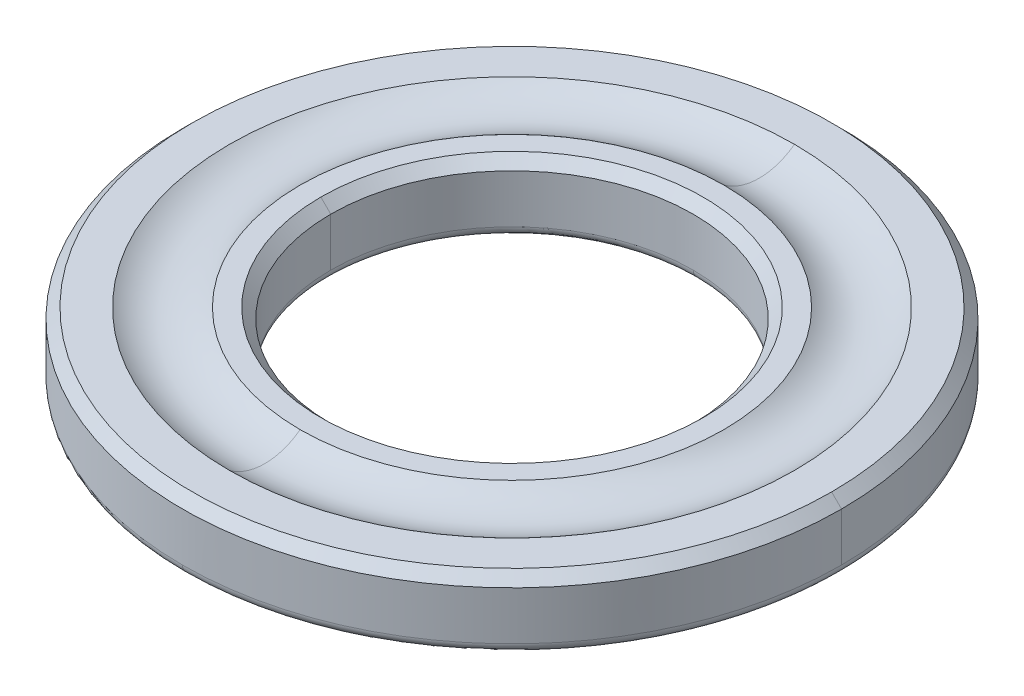
ISO-10303-21;
HEADER;
FILE_DESCRIPTION(('STEP AP214'),'2;1');
FILE_NAME('part.step','',(''),(''),'','','');
FILE_SCHEMA(('AUTOMOTIVE_DESIGN { 1 0 10303 214 1 1 1 1 }'));
ENDSEC;
DATA;
#1=APPLICATION_CONTEXT('core data for automotive mechanical design processes');
#2=APPLICATION_PROTOCOL_DEFINITION('international standard','automotive_design',2000,#1);
#3=PRODUCT_CONTEXT('',#1,'mechanical');
#4=PRODUCT('Part','Part','',(#3));
#5=PRODUCT_RELATED_PRODUCT_CATEGORY('part','',(#4));
#6=PRODUCT_DEFINITION_FORMATION('','',#4);
#7=PRODUCT_DEFINITION_CONTEXT('part definition',#1,'design');
#8=PRODUCT_DEFINITION('design','',#6,#7);
#9=PRODUCT_DEFINITION_SHAPE('','',#8);
#10=(LENGTH_UNIT() NAMED_UNIT(*) SI_UNIT(.MILLI.,.METRE.));
#11=(NAMED_UNIT(*) PLANE_ANGLE_UNIT() SI_UNIT($,.RADIAN.));
#12=(NAMED_UNIT(*) SI_UNIT($,.STERADIAN.) SOLID_ANGLE_UNIT());
#13=UNCERTAINTY_MEASURE_WITH_UNIT(LENGTH_MEASURE(1.E-05),#10,'distance_accuracy_value','');
#14=(GEOMETRIC_REPRESENTATION_CONTEXT(3) GLOBAL_UNCERTAINTY_ASSIGNED_CONTEXT((#13)) GLOBAL_UNIT_ASSIGNED_CONTEXT((#10,
#11,#12)) REPRESENTATION_CONTEXT('',''));
#15=CARTESIAN_POINT('',(0.,0.,0.));
#16=DIRECTION('',(0.,0.,1.));
#17=DIRECTION('',(1.,0.,0.));
#18=AXIS2_PLACEMENT_3D('',#15,#16,#17);
#19=CARTESIAN_POINT('',(0.,0.6,0.));
#20=DIRECTION('',(0.,1.,0.));
#21=DIRECTION('',(0.,0.,1.));
#22=AXIS2_PLACEMENT_3D('',#19,#20,#21);
#23=TOROIDAL_SURFACE('',#22,19.4,0.6);
#24=CARTESIAN_POINT('',(0.,0.6,-19.4));
#25=DIRECTION('',(1.,0.,0.));
#26=DIRECTION('',(0.,0.,-1.));
#27=AXIS2_PLACEMENT_3D('',#24,#25,#26);
#28=CIRCLE('',#27,0.6);
#29=CARTESIAN_POINT('',(0.,0.,-19.4));
#30=VERTEX_POINT('',#29);
#31=CARTESIAN_POINT('',(0.,0.6,-20.));
#32=VERTEX_POINT('',#31);
#33=EDGE_CURVE('E181',#30,#32,#28,.T.);
#34=ORIENTED_EDGE('',*,*,#33,.F.);
#35=CARTESIAN_POINT('',(0.,0.,0.));
#36=DIRECTION('',(0.,1.,0.));
#37=DIRECTION('',(1.,0.,0.));
#38=AXIS2_PLACEMENT_3D('',#35,#36,#37);
#39=CIRCLE('',#38,19.4);
#40=CARTESIAN_POINT('',(0.,0.,19.4));
#41=VERTEX_POINT('',#40);
#42=EDGE_CURVE('E147',#30,#41,#39,.T.);
#43=ORIENTED_EDGE('',*,*,#42,.T.);
#44=CARTESIAN_POINT('',(0.,0.6,19.4));
#45=DIRECTION('',(-1.,0.,0.));
#46=DIRECTION('',(0.,0.,1.));
#47=AXIS2_PLACEMENT_3D('',#44,#45,#46);
#48=CIRCLE('',#47,0.6);
#49=CARTESIAN_POINT('',(0.,0.6,20.));
#50=VERTEX_POINT('',#49);
#51=EDGE_CURVE('E202',#41,#50,#48,.T.);
#52=ORIENTED_EDGE('',*,*,#51,.T.);
#53=CARTESIAN_POINT('',(0.,0.6,0.));
#54=DIRECTION('',(0.,1.,0.));
#55=DIRECTION('',(1.,0.,0.));
#56=AXIS2_PLACEMENT_3D('',#53,#54,#55);
#57=CIRCLE('',#56,20.);
#58=CARTESIAN_POINT('',(-20.,0.6,0.));
#59=VERTEX_POINT('',#58);
#60=EDGE_CURVE('E158',#59,#50,#57,.T.);
#61=ORIENTED_EDGE('',*,*,#60,.F.);
#62=CARTESIAN_POINT('',(0.,0.6,0.));
#63=DIRECTION('',(0.,1.,0.));
#64=DIRECTION('',(1.,0.,0.));
#65=AXIS2_PLACEMENT_3D('',#62,#63,#64);
#66=CIRCLE('',#65,20.);
#67=EDGE_CURVE('E11',#32,#59,#66,.T.);
#68=ORIENTED_EDGE('',*,*,#67,.F.);
#69=EDGE_LOOP('',(#34,#43,#52,#61,#68));
#70=FACE_BOUND('',#69,.T.);
#71=ADVANCED_FACE('F17',(#70),#23,.T.);
#72=CARTESIAN_POINT('',(0.,2.0712,0.));
#73=DIRECTION('',(0.,-1.,0.));
#74=DIRECTION('',(1.,0.,0.));
#75=AXIS2_PLACEMENT_3D('',#72,#73,#74);
#76=CYLINDRICAL_SURFACE('',#75,20.);
#77=DIRECTION('',(0.,-1.,0.));
#78=VECTOR('',#77,1.);
#79=CARTESIAN_POINT('',(-20.,2.0712,0.));
#80=LINE('',#79,#78);
#81=CARTESIAN_POINT('',(-20.,3.5424,0.));
#82=VERTEX_POINT('',#81);
#83=EDGE_CURVE('E162',#82,#59,#80,.T.);
#84=ORIENTED_EDGE('',*,*,#83,.F.);
#85=CARTESIAN_POINT('',(0.,3.5424,0.));
#86=DIRECTION('',(0.,1.,0.));
#87=DIRECTION('',(1.,0.,0.));
#88=AXIS2_PLACEMENT_3D('',#85,#86,#87);
#89=CIRCLE('',#88,20.);
#90=CARTESIAN_POINT('',(20.,3.5424,0.));
#91=VERTEX_POINT('',#90);
#92=EDGE_CURVE('E28',#91,#82,#89,.T.);
#93=ORIENTED_EDGE('',*,*,#92,.F.);
#94=DIRECTION('',(0.,-1.,0.));
#95=VECTOR('',#94,1.);
#96=CARTESIAN_POINT('',(20.,2.0712,0.));
#97=LINE('',#96,#95);
#98=CARTESIAN_POINT('',(20.,0.6,0.));
#99=VERTEX_POINT('',#98);
#100=EDGE_CURVE('E161',#91,#99,#97,.T.);
#101=ORIENTED_EDGE('',*,*,#100,.T.);
#102=CARTESIAN_POINT('',(0.,0.6,0.));
#103=DIRECTION('',(0.,1.,0.));
#104=DIRECTION('',(1.,0.,0.));
#105=AXIS2_PLACEMENT_3D('',#102,#103,#104);
#106=CIRCLE('',#105,20.);
#107=EDGE_CURVE('E184',#99,#32,#106,.T.);
#108=ORIENTED_EDGE('',*,*,#107,.T.);
#109=ORIENTED_EDGE('',*,*,#67,.T.);
#110=EDGE_LOOP('',(#84,#93,#101,#108,#109));
#111=FACE_BOUND('',#110,.T.);
#112=ADVANCED_FACE('F212',(#111),#76,.T.);
#113=CARTESIAN_POINT('',(0.,3.8424,0.));
#114=DIRECTION('',(0.,-1.,0.));
#115=DIRECTION('',(1.,0.,0.));
#116=AXIS2_PLACEMENT_3D('',#113,#114,#115);
#117=CONICAL_SURFACE('',#116,19.7,0.785398163397452);
#118=DIRECTION('',(-0.70710678118655,-0.707106781186545,0.));
#119=VECTOR('',#118,1.);
#120=CARTESIAN_POINT('',(-19.7,3.8424,0.));
#121=LINE('',#120,#119);
#122=CARTESIAN_POINT('',(-19.4,4.1424,0.));
#123=VERTEX_POINT('',#122);
#124=EDGE_CURVE('E163',#123,#82,#121,.T.);
#125=ORIENTED_EDGE('',*,*,#124,.F.);
#126=CARTESIAN_POINT('',(0.,4.1424,0.));
#127=DIRECTION('',(0.,1.,0.));
#128=DIRECTION('',(1.,0.,0.));
#129=AXIS2_PLACEMENT_3D('',#126,#127,#128);
#130=CIRCLE('',#129,19.4);
#131=CARTESIAN_POINT('',(19.4,4.1424,0.));
#132=VERTEX_POINT('',#131);
#133=EDGE_CURVE('E121',#132,#123,#130,.T.);
#134=ORIENTED_EDGE('',*,*,#133,.F.);
#135=DIRECTION('',(0.70710678118655,-0.707106781186545,0.));
#136=VECTOR('',#135,1.);
#137=CARTESIAN_POINT('',(19.7,3.8424,0.));
#138=LINE('',#137,#136);
#139=EDGE_CURVE('E167',#132,#91,#138,.T.);
#140=ORIENTED_EDGE('',*,*,#139,.T.);
#141=ORIENTED_EDGE('',*,*,#92,.T.);
#142=EDGE_LOOP('',(#125,#134,#140,#141));
#143=FACE_BOUND('',#142,.T.);
#144=ADVANCED_FACE('F323',(#143),#117,.T.);
#145=CARTESIAN_POINT('',(18.2716,4.1424,0.));
#146=DIRECTION('',(0.,1.,0.));
#147=DIRECTION('',(1.,0.,0.));
#148=AXIS2_PLACEMENT_3D('',#145,#146,#147);
#149=PLANE('',#148);
#150=CARTESIAN_POINT('',(0.,4.1424,0.));
#151=DIRECTION('',(0.,1.,0.));
#152=DIRECTION('',(1.,0.,0.));
#153=AXIS2_PLACEMENT_3D('',#150,#151,#152);
#154=CIRCLE('',#153,17.1432);
#155=CARTESIAN_POINT('',(0.,4.1424,17.1432));
#156=VERTEX_POINT('',#155);
#157=CARTESIAN_POINT('',(0.,4.1424,-17.1432));
#158=VERTEX_POINT('',#157);
#159=EDGE_CURVE('E111',#156,#158,#154,.T.);
#160=ORIENTED_EDGE('',*,*,#159,.F.);
#161=CARTESIAN_POINT('',(0.,4.1424,0.));
#162=DIRECTION('',(0.,1.,0.));
#163=DIRECTION('',(1.,0.,0.));
#164=AXIS2_PLACEMENT_3D('',#161,#162,#163);
#165=CIRCLE('',#164,17.1432);
#166=EDGE_CURVE('E116',#158,#156,#165,.T.);
#167=ORIENTED_EDGE('',*,*,#166,.F.);
#168=EDGE_LOOP('',(#160,#167));
#169=FACE_BOUND('',#168,.T.);
#170=ORIENTED_EDGE('',*,*,#133,.T.);
#171=CARTESIAN_POINT('',(0.,4.1424,0.));
#172=DIRECTION('',(0.,1.,0.));
#173=DIRECTION('',(1.,0.,0.));
#174=AXIS2_PLACEMENT_3D('',#171,#172,#173);
#175=CIRCLE('',#174,19.4);
#176=EDGE_CURVE('E168',#123,#132,#175,.T.);
#177=ORIENTED_EDGE('',*,*,#176,.T.);
#178=EDGE_LOOP('',(#170,#177));
#179=FACE_BOUND('',#178,.T.);
#180=ADVANCED_FACE('F113',(#169,#179),#149,.T.);
#181=CARTESIAN_POINT('',(0.,7.,0.));
#182=DIRECTION('',(0.,1.,0.));
#183=DIRECTION('',(0.,0.,1.));
#184=AXIS2_PLACEMENT_3D('',#181,#182,#183);
#185=TOROIDAL_SURFACE('',#184,15.,3.572);
#186=CARTESIAN_POINT('',(0.,7.,-15.));
#187=DIRECTION('',(1.,0.,0.));
#188=DIRECTION('',(0.,0.,-1.));
#189=AXIS2_PLACEMENT_3D('',#186,#187,#188);
#190=CIRCLE('',#189,3.572);
#191=CARTESIAN_POINT('',(0.,4.1424,-12.8568));
#192=VERTEX_POINT('',#191);
#193=EDGE_CURVE('E134',#192,#158,#190,.T.);
#194=ORIENTED_EDGE('',*,*,#193,.F.);
#195=CARTESIAN_POINT('',(0.,4.1424,0.));
#196=DIRECTION('',(0.,1.,0.));
#197=DIRECTION('',(1.,0.,0.));
#198=AXIS2_PLACEMENT_3D('',#195,#196,#197);
#199=CIRCLE('',#198,12.8568);
#200=CARTESIAN_POINT('',(0.,4.1424,12.8568));
#201=VERTEX_POINT('',#200);
#202=EDGE_CURVE('E122',#201,#192,#199,.T.);
#203=ORIENTED_EDGE('',*,*,#202,.F.);
#204=CARTESIAN_POINT('',(0.,7.,15.));
#205=DIRECTION('',(-1.,0.,0.));
#206=DIRECTION('',(0.,0.,1.));
#207=AXIS2_PLACEMENT_3D('',#204,#205,#206);
#208=CIRCLE('',#207,3.572);
#209=EDGE_CURVE('E125',#201,#156,#208,.T.);
#210=ORIENTED_EDGE('',*,*,#209,.T.);
#211=ORIENTED_EDGE('',*,*,#159,.T.);
#212=EDGE_LOOP('',(#194,#203,#210,#211));
#213=FACE_BOUND('',#212,.T.);
#214=ADVANCED_FACE('F126',(#213),#185,.F.);
#215=CARTESIAN_POINT('',(12.2284,4.1424,0.));
#216=DIRECTION('',(0.,1.,0.));
#217=DIRECTION('',(1.,0.,0.));
#218=AXIS2_PLACEMENT_3D('',#215,#216,#217);
#219=PLANE('',#218);
#220=CARTESIAN_POINT('',(0.,4.1424,0.));
#221=DIRECTION('',(0.,1.,0.));
#222=DIRECTION('',(1.,0.,0.));
#223=AXIS2_PLACEMENT_3D('',#220,#221,#222);
#224=CIRCLE('',#223,11.6);
#225=CARTESIAN_POINT('',(11.6,4.1424,0.));
#226=VERTEX_POINT('',#225);
#227=CARTESIAN_POINT('',(-11.6,4.1424,0.));
#228=VERTEX_POINT('',#227);
#229=EDGE_CURVE('E153',#226,#228,#224,.T.);
#230=ORIENTED_EDGE('',*,*,#229,.F.);
#231=CARTESIAN_POINT('',(0.,4.1424,0.));
#232=DIRECTION('',(0.,1.,0.));
#233=DIRECTION('',(1.,0.,0.));
#234=AXIS2_PLACEMENT_3D('',#231,#232,#233);
#235=CIRCLE('',#234,11.6);
#236=EDGE_CURVE('E245',#228,#226,#235,.T.);
#237=ORIENTED_EDGE('',*,*,#236,.F.);
#238=EDGE_LOOP('',(#230,#237));
#239=FACE_BOUND('',#238,.T.);
#240=ORIENTED_EDGE('',*,*,#202,.T.);
#241=CARTESIAN_POINT('',(0.,4.1424,0.));
#242=DIRECTION('',(0.,1.,0.));
#243=DIRECTION('',(1.,0.,0.));
#244=AXIS2_PLACEMENT_3D('',#241,#242,#243);
#245=CIRCLE('',#244,12.8568);
#246=EDGE_CURVE('E141',#192,#201,#245,.T.);
#247=ORIENTED_EDGE('',*,*,#246,.T.);
#248=EDGE_LOOP('',(#240,#247));
#249=FACE_BOUND('',#248,.T.);
#250=ADVANCED_FACE('F354',(#239,#249),#219,.T.);
#251=CARTESIAN_POINT('',(0.,3.8424,0.));
#252=DIRECTION('',(0.,1.,0.));
#253=DIRECTION('',(1.,0.,0.));
#254=AXIS2_PLACEMENT_3D('',#251,#252,#253);
#255=CONICAL_SURFACE('',#254,11.3,0.785398163397449);
#256=DIRECTION('',(-0.707106781186548,0.707106781186547,0.));
#257=VECTOR('',#256,1.);
#258=CARTESIAN_POINT('',(-11.3,3.8424,0.));
#259=LINE('',#258,#257);
#260=CARTESIAN_POINT('',(-11.,3.5424,0.));
#261=VERTEX_POINT('',#260);
#262=EDGE_CURVE('E252',#261,#228,#259,.T.);
#263=ORIENTED_EDGE('',*,*,#262,.F.);
#264=CARTESIAN_POINT('',(0.,3.5424,0.));
#265=DIRECTION('',(0.,1.,0.));
#266=DIRECTION('',(1.,0.,0.));
#267=AXIS2_PLACEMENT_3D('',#264,#265,#266);
#268=CIRCLE('',#267,11.);
#269=CARTESIAN_POINT('',(11.,3.5424,0.));
#270=VERTEX_POINT('',#269);
#271=EDGE_CURVE('E174',#270,#261,#268,.T.);
#272=ORIENTED_EDGE('',*,*,#271,.F.);
#273=DIRECTION('',(0.707106781186548,0.707106781186547,0.));
#274=VECTOR('',#273,1.);
#275=CARTESIAN_POINT('',(11.3,3.8424,0.));
#276=LINE('',#275,#274);
#277=EDGE_CURVE('E236',#270,#226,#276,.T.);
#278=ORIENTED_EDGE('',*,*,#277,.T.);
#279=ORIENTED_EDGE('',*,*,#229,.T.);
#280=EDGE_LOOP('',(#263,#272,#278,#279));
#281=FACE_BOUND('',#280,.T.);
#282=ADVANCED_FACE('F19',(#281),#255,.F.);
#283=CARTESIAN_POINT('',(0.,2.0712,0.));
#284=DIRECTION('',(0.,-1.,0.));
#285=DIRECTION('',(1.,0.,0.));
#286=AXIS2_PLACEMENT_3D('',#283,#284,#285);
#287=CYLINDRICAL_SURFACE('',#286,11.);
#288=DIRECTION('',(0.,-1.,0.));
#289=VECTOR('',#288,1.);
#290=CARTESIAN_POINT('',(-11.,2.0712,0.));
#291=LINE('',#290,#289);
#292=CARTESIAN_POINT('',(-11.,0.6,0.));
#293=VERTEX_POINT('',#292);
#294=EDGE_CURVE('E169',#261,#293,#291,.T.);
#295=ORIENTED_EDGE('',*,*,#294,.F.);
#296=CARTESIAN_POINT('',(0.,3.5424,0.));
#297=DIRECTION('',(0.,1.,0.));
#298=DIRECTION('',(1.,0.,0.));
#299=AXIS2_PLACEMENT_3D('',#296,#297,#298);
#300=CIRCLE('',#299,11.);
#301=EDGE_CURVE('E131',#261,#270,#300,.T.);
#302=ORIENTED_EDGE('',*,*,#301,.T.);
#303=DIRECTION('',(0.,-1.,0.));
#304=VECTOR('',#303,1.);
#305=CARTESIAN_POINT('',(11.,2.0712,0.));
#306=LINE('',#305,#304);
#307=CARTESIAN_POINT('',(11.,0.6,0.));
#308=VERTEX_POINT('',#307);
#309=EDGE_CURVE('E256',#270,#308,#306,.T.);
#310=ORIENTED_EDGE('',*,*,#309,.T.);
#311=CARTESIAN_POINT('',(0.,0.6,0.));
#312=DIRECTION('',(0.,1.,0.));
#313=DIRECTION('',(1.,0.,0.));
#314=AXIS2_PLACEMENT_3D('',#311,#312,#313);
#315=CIRCLE('',#314,11.);
#316=CARTESIAN_POINT('',(0.,0.6,11.));
#317=VERTEX_POINT('',#316);
#318=EDGE_CURVE('E253',#317,#308,#315,.T.);
#319=ORIENTED_EDGE('',*,*,#318,.F.);
#320=CARTESIAN_POINT('',(0.,0.6,0.));
#321=DIRECTION('',(0.,1.,0.));
#322=DIRECTION('',(1.,0.,0.));
#323=AXIS2_PLACEMENT_3D('',#320,#321,#322);
#324=CIRCLE('',#323,11.);
#325=EDGE_CURVE('E271',#293,#317,#324,.T.);
#326=ORIENTED_EDGE('',*,*,#325,.F.);
#327=EDGE_LOOP('',(#295,#302,#310,#319,#326));
#328=FACE_BOUND('',#327,.T.);
#329=ADVANCED_FACE('F296',(#328),#287,.F.);
#330=CARTESIAN_POINT('',(0.,0.6,0.));
#331=DIRECTION('',(0.,1.,0.));
#332=DIRECTION('',(0.,0.,1.));
#333=AXIS2_PLACEMENT_3D('',#330,#331,#332);
#334=TOROIDAL_SURFACE('',#333,11.6,0.6);
#335=CARTESIAN_POINT('',(0.,0.6,-11.6));
#336=DIRECTION('',(1.,0.,0.));
#337=DIRECTION('',(0.,0.,-1.));
#338=AXIS2_PLACEMENT_3D('',#335,#336,#337);
#339=CIRCLE('',#338,0.6);
#340=CARTESIAN_POINT('',(0.,0.6,-11.));
#341=VERTEX_POINT('',#340);
#342=CARTESIAN_POINT('',(0.,0.,-11.6));
#343=VERTEX_POINT('',#342);
#344=EDGE_CURVE('E157',#341,#343,#339,.T.);
#345=ORIENTED_EDGE('',*,*,#344,.F.);
#346=CARTESIAN_POINT('',(0.,0.6,0.));
#347=DIRECTION('',(0.,1.,0.));
#348=DIRECTION('',(1.,0.,0.));
#349=AXIS2_PLACEMENT_3D('',#346,#347,#348);
#350=CIRCLE('',#349,11.);
#351=EDGE_CURVE('E173',#341,#293,#350,.T.);
#352=ORIENTED_EDGE('',*,*,#351,.T.);
#353=ORIENTED_EDGE('',*,*,#325,.T.);
#354=CARTESIAN_POINT('',(0.,0.6,11.6));
#355=DIRECTION('',(-1.,0.,0.));
#356=DIRECTION('',(0.,0.,1.));
#357=AXIS2_PLACEMENT_3D('',#354,#355,#356);
#358=CIRCLE('',#357,0.6);
#359=CARTESIAN_POINT('',(0.,0.,11.6));
#360=VERTEX_POINT('',#359);
#361=EDGE_CURVE('E150',#317,#360,#358,.T.);
#362=ORIENTED_EDGE('',*,*,#361,.T.);
#363=CARTESIAN_POINT('',(0.,0.,0.));
#364=DIRECTION('',(0.,1.,0.));
#365=DIRECTION('',(1.,0.,0.));
#366=AXIS2_PLACEMENT_3D('',#363,#364,#365);
#367=CIRCLE('',#366,11.6);
#368=EDGE_CURVE('E42',#343,#360,#367,.T.);
#369=ORIENTED_EDGE('',*,*,#368,.F.);
#370=EDGE_LOOP('',(#345,#352,#353,#362,#369));
#371=FACE_BOUND('',#370,.T.);
#372=ADVANCED_FACE('F357',(#371),#334,.T.);
#373=CARTESIAN_POINT('',(15.5,0.,0.));
#374=DIRECTION('',(0.,-1.,0.));
#375=DIRECTION('',(0.,0.,-1.));
#376=AXIS2_PLACEMENT_3D('',#373,#374,#375);
#377=PLANE('',#376);
#378=CARTESIAN_POINT('',(0.,0.,0.));
#379=DIRECTION('',(0.,1.,0.));
#380=DIRECTION('',(1.,0.,0.));
#381=AXIS2_PLACEMENT_3D('',#378,#379,#380);
#382=CIRCLE('',#381,11.6);
#383=EDGE_CURVE('E154',#360,#343,#382,.T.);
#384=ORIENTED_EDGE('',*,*,#383,.T.);
#385=ORIENTED_EDGE('',*,*,#368,.T.);
#386=EDGE_LOOP('',(#384,#385));
#387=FACE_BOUND('',#386,.T.);
#388=CARTESIAN_POINT('',(0.,0.,0.));
#389=DIRECTION('',(0.,1.,0.));
#390=DIRECTION('',(1.,0.,0.));
#391=AXIS2_PLACEMENT_3D('',#388,#389,#390);
#392=CIRCLE('',#391,19.4);
#393=EDGE_CURVE('E144',#41,#30,#392,.T.);
#394=ORIENTED_EDGE('',*,*,#393,.F.);
#395=ORIENTED_EDGE('',*,*,#42,.F.);
#396=EDGE_LOOP('',(#394,#395));
#397=FACE_BOUND('',#396,.T.);
#398=ADVANCED_FACE('F207',(#387,#397),#377,.T.);
#399=CARTESIAN_POINT('',(0.,0.6,0.));
#400=DIRECTION('',(0.,1.,0.));
#401=DIRECTION('',(0.,0.,1.));
#402=AXIS2_PLACEMENT_3D('',#399,#400,#401);
#403=TOROIDAL_SURFACE('',#402,11.6,0.6);
#404=ORIENTED_EDGE('',*,*,#318,.T.);
#405=CARTESIAN_POINT('',(0.,0.6,0.));
#406=DIRECTION('',(0.,1.,0.));
#407=DIRECTION('',(1.,0.,0.));
#408=AXIS2_PLACEMENT_3D('',#405,#406,#407);
#409=CIRCLE('',#408,11.);
#410=EDGE_CURVE('E228',#308,#341,#409,.T.);
#411=ORIENTED_EDGE('',*,*,#410,.T.);
#412=ORIENTED_EDGE('',*,*,#344,.T.);
#413=ORIENTED_EDGE('',*,*,#383,.F.);
#414=ORIENTED_EDGE('',*,*,#361,.F.);
#415=EDGE_LOOP('',(#404,#411,#412,#413,#414));
#416=FACE_BOUND('',#415,.T.);
#417=ADVANCED_FACE('F350',(#416),#403,.T.);
#418=CARTESIAN_POINT('',(0.,2.0712,0.));
#419=DIRECTION('',(0.,-1.,0.));
#420=DIRECTION('',(1.,0.,0.));
#421=AXIS2_PLACEMENT_3D('',#418,#419,#420);
#422=CYLINDRICAL_SURFACE('',#421,11.);
#423=ORIENTED_EDGE('',*,*,#271,.T.);
#424=ORIENTED_EDGE('',*,*,#294,.T.);
#425=ORIENTED_EDGE('',*,*,#351,.F.);
#426=ORIENTED_EDGE('',*,*,#410,.F.);
#427=ORIENTED_EDGE('',*,*,#309,.F.);
#428=EDGE_LOOP('',(#423,#424,#425,#426,#427));
#429=FACE_BOUND('',#428,.T.);
#430=ADVANCED_FACE('F347',(#429),#422,.F.);
#431=CARTESIAN_POINT('',(0.,3.8424,0.));
#432=DIRECTION('',(0.,1.,0.));
#433=DIRECTION('',(1.,0.,0.));
#434=AXIS2_PLACEMENT_3D('',#431,#432,#433);
#435=CONICAL_SURFACE('',#434,11.3,0.785398163397449);
#436=ORIENTED_EDGE('',*,*,#301,.F.);
#437=ORIENTED_EDGE('',*,*,#262,.T.);
#438=ORIENTED_EDGE('',*,*,#236,.T.);
#439=ORIENTED_EDGE('',*,*,#277,.F.);
#440=EDGE_LOOP('',(#436,#437,#438,#439));
#441=FACE_BOUND('',#440,.T.);
#442=ADVANCED_FACE('F301',(#441),#435,.F.);
#443=CARTESIAN_POINT('',(0.,7.,0.));
#444=DIRECTION('',(0.,1.,0.));
#445=DIRECTION('',(0.,0.,1.));
#446=AXIS2_PLACEMENT_3D('',#443,#444,#445);
#447=TOROIDAL_SURFACE('',#446,15.,3.572);
#448=ORIENTED_EDGE('',*,*,#246,.F.);
#449=ORIENTED_EDGE('',*,*,#193,.T.);
#450=ORIENTED_EDGE('',*,*,#166,.T.);
#451=ORIENTED_EDGE('',*,*,#209,.F.);
#452=EDGE_LOOP('',(#448,#449,#450,#451));
#453=FACE_BOUND('',#452,.T.);
#454=ADVANCED_FACE('F133',(#453),#447,.F.);
#455=CARTESIAN_POINT('',(0.,3.8424,0.));
#456=DIRECTION('',(0.,-1.,0.));
#457=DIRECTION('',(1.,0.,0.));
#458=AXIS2_PLACEMENT_3D('',#455,#456,#457);
#459=CONICAL_SURFACE('',#458,19.7,0.785398163397452);
#460=ORIENTED_EDGE('',*,*,#176,.F.);
#461=ORIENTED_EDGE('',*,*,#124,.T.);
#462=CARTESIAN_POINT('',(0.,3.5424,0.));
#463=DIRECTION('',(0.,1.,0.));
#464=DIRECTION('',(1.,0.,0.));
#465=AXIS2_PLACEMENT_3D('',#462,#463,#464);
#466=CIRCLE('',#465,20.);
#467=EDGE_CURVE('E180',#82,#91,#466,.T.);
#468=ORIENTED_EDGE('',*,*,#467,.T.);
#469=ORIENTED_EDGE('',*,*,#139,.F.);
#470=EDGE_LOOP('',(#460,#461,#468,#469));
#471=FACE_BOUND('',#470,.T.);
#472=ADVANCED_FACE('F327',(#471),#459,.T.);
#473=CARTESIAN_POINT('',(0.,2.0712,0.));
#474=DIRECTION('',(0.,-1.,0.));
#475=DIRECTION('',(1.,0.,0.));
#476=AXIS2_PLACEMENT_3D('',#473,#474,#475);
#477=CYLINDRICAL_SURFACE('',#476,20.);
#478=ORIENTED_EDGE('',*,*,#467,.F.);
#479=ORIENTED_EDGE('',*,*,#83,.T.);
#480=ORIENTED_EDGE('',*,*,#60,.T.);
#481=CARTESIAN_POINT('',(0.,0.6,0.));
#482=DIRECTION('',(0.,1.,0.));
#483=DIRECTION('',(1.,0.,0.));
#484=AXIS2_PLACEMENT_3D('',#481,#482,#483);
#485=CIRCLE('',#484,20.);
#486=EDGE_CURVE('E21',#50,#99,#485,.T.);
#487=ORIENTED_EDGE('',*,*,#486,.T.);
#488=ORIENTED_EDGE('',*,*,#100,.F.);
#489=EDGE_LOOP('',(#478,#479,#480,#487,#488));
#490=FACE_BOUND('',#489,.T.);
#491=ADVANCED_FACE('F329',(#490),#477,.T.);
#492=CARTESIAN_POINT('',(0.,0.6,0.));
#493=DIRECTION('',(0.,1.,0.));
#494=DIRECTION('',(0.,0.,1.));
#495=AXIS2_PLACEMENT_3D('',#492,#493,#494);
#496=TOROIDAL_SURFACE('',#495,19.4,0.6);
#497=ORIENTED_EDGE('',*,*,#393,.T.);
#498=ORIENTED_EDGE('',*,*,#33,.T.);
#499=ORIENTED_EDGE('',*,*,#107,.F.);
#500=ORIENTED_EDGE('',*,*,#486,.F.);
#501=ORIENTED_EDGE('',*,*,#51,.F.);
#502=EDGE_LOOP('',(#497,#498,#499,#500,#501));
#503=FACE_BOUND('',#502,.T.);
#504=ADVANCED_FACE('F199',(#503),#496,.T.);
#505=CLOSED_SHELL('',(#71,#112,#144,#180,#214,#250,#282,#329,#372,#398,#417,#430,#442,#454,#472,
#491,#504));
#506=MANIFOLD_SOLID_BREP('B1',#505);
#507=ADVANCED_BREP_SHAPE_REPRESENTATION('',(#18,#506),#14);
#508=SHAPE_DEFINITION_REPRESENTATION(#9,#507);
ENDSEC;
END-ISO-10303-21;
